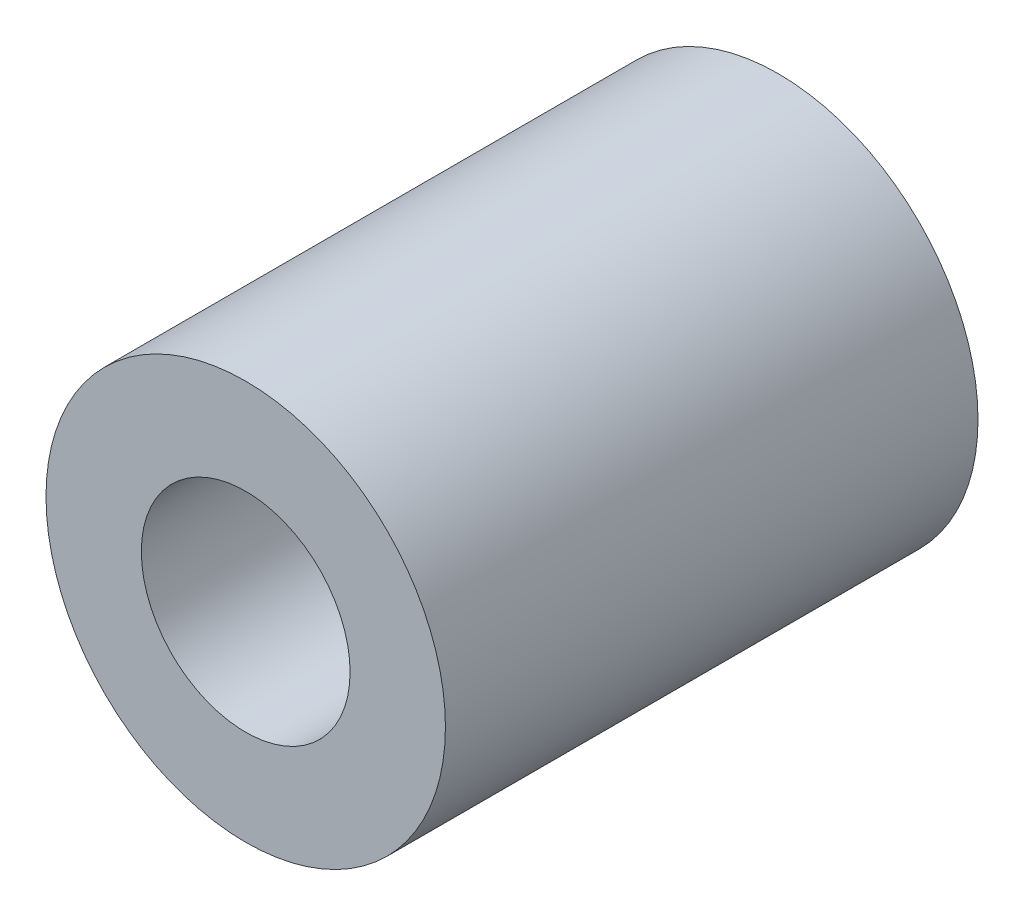
ISO-10303-21;
HEADER;
FILE_DESCRIPTION(('STEP AP214'),'2;1');
FILE_NAME('part.step','',(''),(''),'','','');
FILE_SCHEMA(('AUTOMOTIVE_DESIGN { 1 0 10303 214 1 1 1 1 }'));
ENDSEC;
DATA;
#1=APPLICATION_CONTEXT('core data for automotive mechanical design processes');
#2=APPLICATION_PROTOCOL_DEFINITION('international standard','automotive_design',2000,#1);
#3=PRODUCT_CONTEXT('',#1,'mechanical');
#4=PRODUCT('Part','Part','',(#3));
#5=PRODUCT_RELATED_PRODUCT_CATEGORY('part','',(#4));
#6=PRODUCT_DEFINITION_FORMATION('','',#4);
#7=PRODUCT_DEFINITION_CONTEXT('part definition',#1,'design');
#8=PRODUCT_DEFINITION('design','',#6,#7);
#9=PRODUCT_DEFINITION_SHAPE('','',#8);
#10=(LENGTH_UNIT() NAMED_UNIT(*) SI_UNIT(.MILLI.,.METRE.));
#11=(NAMED_UNIT(*) PLANE_ANGLE_UNIT() SI_UNIT($,.RADIAN.));
#12=(NAMED_UNIT(*) SI_UNIT($,.STERADIAN.) SOLID_ANGLE_UNIT());
#13=UNCERTAINTY_MEASURE_WITH_UNIT(LENGTH_MEASURE(1.E-05),#10,'distance_accuracy_value','');
#14=(GEOMETRIC_REPRESENTATION_CONTEXT(3) GLOBAL_UNCERTAINTY_ASSIGNED_CONTEXT((#13)) GLOBAL_UNIT_ASSIGNED_CONTEXT((#10,
#11,#12)) REPRESENTATION_CONTEXT('',''));
#15=CARTESIAN_POINT('',(0.,0.,0.));
#16=DIRECTION('',(0.,0.,1.));
#17=DIRECTION('',(1.,0.,0.));
#18=AXIS2_PLACEMENT_3D('',#15,#16,#17);
#19=CARTESIAN_POINT('',(0.,0.,6.35));
#20=DIRECTION('',(0.,0.,1.));
#21=DIRECTION('',(1.,0.,0.));
#22=AXIS2_PLACEMENT_3D('',#19,#20,#21);
#23=PLANE('',#22);
#24=CARTESIAN_POINT('',(0.,0.,6.35));
#25=DIRECTION('',(0.,0.,1.));
#26=DIRECTION('',(1.,0.,0.));
#27=AXIS2_PLACEMENT_3D('',#24,#25,#26);
#28=CIRCLE('',#27,4.7625);
#29=CARTESIAN_POINT('',(4.7625,0.,6.35));
#30=VERTEX_POINT('',#29);
#31=EDGE_CURVE('E10',#30,#30,#28,.T.);
#32=ORIENTED_EDGE('',*,*,#31,.T.);
#33=EDGE_LOOP('',(#32));
#34=FACE_BOUND('',#33,.T.);
#35=CARTESIAN_POINT('',(0.,0.,6.35));
#36=DIRECTION('',(0.,0.,1.));
#37=DIRECTION('',(1.,0.,0.));
#38=AXIS2_PLACEMENT_3D('',#35,#36,#37);
#39=CIRCLE('',#38,2.4892);
#40=CARTESIAN_POINT('',(2.4892,0.,6.35));
#41=VERTEX_POINT('',#40);
#42=EDGE_CURVE('E54',#41,#41,#39,.T.);
#43=ORIENTED_EDGE('',*,*,#42,.F.);
#44=EDGE_LOOP('',(#43));
#45=FACE_BOUND('',#44,.T.);
#46=ADVANCED_FACE('F41',(#34,#45),#23,.T.);
#47=CARTESIAN_POINT('',(0.,0.,-6.35));
#48=DIRECTION('',(0.,0.,1.));
#49=DIRECTION('',(1.,0.,0.));
#50=AXIS2_PLACEMENT_3D('',#47,#48,#49);
#51=PLANE('',#50);
#52=CARTESIAN_POINT('',(0.,0.,-6.35));
#53=DIRECTION('',(0.,0.,1.));
#54=DIRECTION('',(1.,0.,0.));
#55=AXIS2_PLACEMENT_3D('',#52,#53,#54);
#56=CIRCLE('',#55,4.7625);
#57=CARTESIAN_POINT('',(4.7625,0.,-6.35));
#58=VERTEX_POINT('',#57);
#59=EDGE_CURVE('E45',#58,#58,#56,.T.);
#60=ORIENTED_EDGE('',*,*,#59,.F.);
#61=EDGE_LOOP('',(#60));
#62=FACE_BOUND('',#61,.T.);
#63=CARTESIAN_POINT('',(0.,0.,-6.35));
#64=DIRECTION('',(0.,0.,1.));
#65=DIRECTION('',(1.,0.,0.));
#66=AXIS2_PLACEMENT_3D('',#63,#64,#65);
#67=CIRCLE('',#66,2.4892);
#68=CARTESIAN_POINT('',(2.4892,0.,-6.35));
#69=VERTEX_POINT('',#68);
#70=EDGE_CURVE('E56',#69,#69,#67,.T.);
#71=ORIENTED_EDGE('',*,*,#70,.T.);
#72=EDGE_LOOP('',(#71));
#73=FACE_BOUND('',#72,.T.);
#74=ADVANCED_FACE('F68',(#62,#73),#51,.F.);
#75=CARTESIAN_POINT('',(0.,0.,6.35));
#76=DIRECTION('',(0.,0.,-1.));
#77=DIRECTION('',(-1.,0.,0.));
#78=AXIS2_PLACEMENT_3D('',#75,#76,#77);
#79=CYLINDRICAL_SURFACE('',#78,4.7625);
#80=ORIENTED_EDGE('',*,*,#31,.F.);
#81=EDGE_LOOP('',(#80));
#82=FACE_BOUND('',#81,.T.);
#83=ORIENTED_EDGE('',*,*,#59,.T.);
#84=EDGE_LOOP('',(#83));
#85=FACE_BOUND('',#84,.T.);
#86=ADVANCED_FACE('F43',(#82,#85),#79,.T.);
#87=CARTESIAN_POINT('',(0.,0.,6.35));
#88=DIRECTION('',(0.,0.,-1.));
#89=DIRECTION('',(-1.,0.,0.));
#90=AXIS2_PLACEMENT_3D('',#87,#88,#89);
#91=CYLINDRICAL_SURFACE('',#90,2.4892);
#92=ORIENTED_EDGE('',*,*,#42,.T.);
#93=EDGE_LOOP('',(#92));
#94=FACE_BOUND('',#93,.T.);
#95=ORIENTED_EDGE('',*,*,#70,.F.);
#96=EDGE_LOOP('',(#95));
#97=FACE_BOUND('',#96,.T.);
#98=ADVANCED_FACE('F64',(#94,#97),#91,.F.);
#99=CLOSED_SHELL('',(#46,#74,#86,#98));
#100=MANIFOLD_SOLID_BREP('B2',#99);
#101=ADVANCED_BREP_SHAPE_REPRESENTATION('',(#18,#100),#14);
#102=SHAPE_DEFINITION_REPRESENTATION(#9,#101);
ENDSEC;
END-ISO-10303-21;
